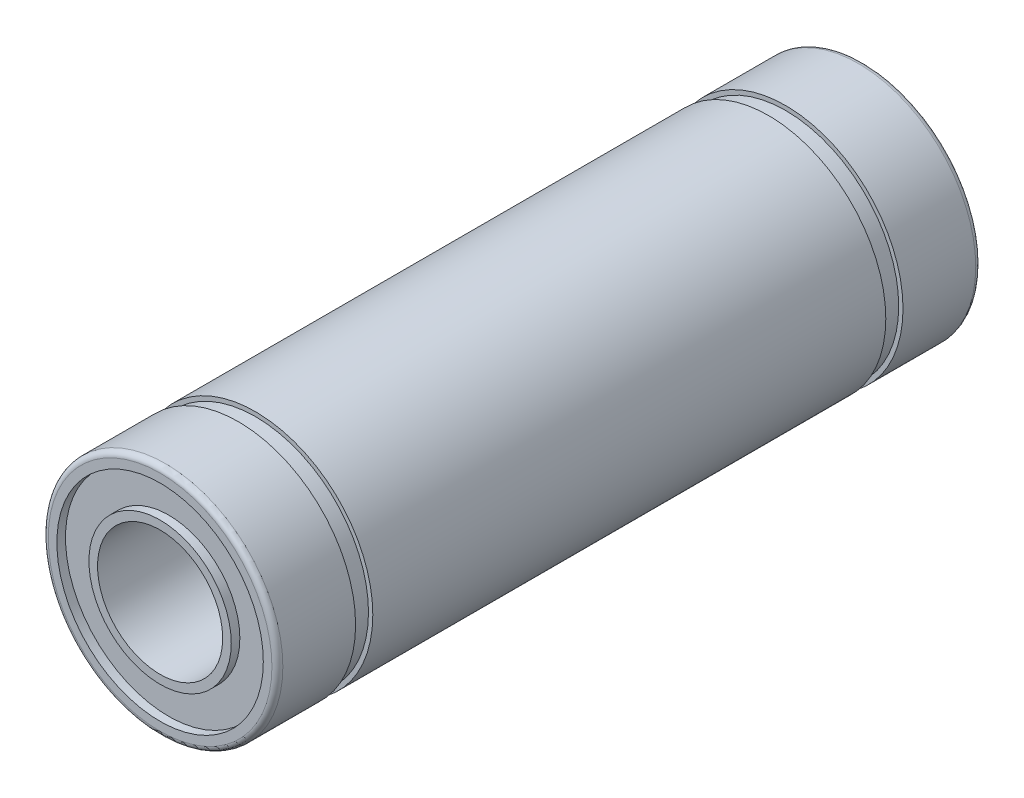
ISO-10303-21;
HEADER;
FILE_DESCRIPTION(('STEP AP214'),'2;1');
FILE_NAME('part.step','',(''),(''),'','','');
FILE_SCHEMA(('AUTOMOTIVE_DESIGN { 1 0 10303 214 1 1 1 1 }'));
ENDSEC;
DATA;
#1=APPLICATION_CONTEXT('core data for automotive mechanical design processes');
#2=APPLICATION_PROTOCOL_DEFINITION('international standard','automotive_design',2000,#1);
#3=PRODUCT_CONTEXT('',#1,'mechanical');
#4=PRODUCT('Part','Part','',(#3));
#5=PRODUCT_RELATED_PRODUCT_CATEGORY('part','',(#4));
#6=PRODUCT_DEFINITION_FORMATION('','',#4);
#7=PRODUCT_DEFINITION_CONTEXT('part definition',#1,'design');
#8=PRODUCT_DEFINITION('design','',#6,#7);
#9=PRODUCT_DEFINITION_SHAPE('','',#8);
#10=(LENGTH_UNIT() NAMED_UNIT(*) SI_UNIT(.MILLI.,.METRE.));
#11=(NAMED_UNIT(*) PLANE_ANGLE_UNIT() SI_UNIT($,.RADIAN.));
#12=(NAMED_UNIT(*) SI_UNIT($,.STERADIAN.) SOLID_ANGLE_UNIT());
#13=UNCERTAINTY_MEASURE_WITH_UNIT(LENGTH_MEASURE(1.E-05),#10,'distance_accuracy_value','');
#14=(GEOMETRIC_REPRESENTATION_CONTEXT(3) GLOBAL_UNCERTAINTY_ASSIGNED_CONTEXT((#13)) GLOBAL_UNIT_ASSIGNED_CONTEXT((#10,
#11,#12)) REPRESENTATION_CONTEXT('',''));
#15=CARTESIAN_POINT('',(0.,0.,0.));
#16=DIRECTION('',(0.,0.,1.));
#17=DIRECTION('',(1.,0.,0.));
#18=AXIS2_PLACEMENT_3D('',#15,#16,#17);
#19=CARTESIAN_POINT('',(0.,0.,45.));
#20=DIRECTION('',(0.,0.,1.));
#21=DIRECTION('',(0.,-1.,0.));
#22=AXIS2_PLACEMENT_3D('',#19,#20,#21);
#23=PLANE('',#22);
#24=CARTESIAN_POINT('',(0.,0.,45.));
#25=DIRECTION('',(0.,0.,1.));
#26=DIRECTION('',(1.,0.,0.));
#27=AXIS2_PLACEMENT_3D('',#24,#25,#26);
#28=CIRCLE('',#27,7.15);
#29=CARTESIAN_POINT('',(7.15,0.,45.));
#30=VERTEX_POINT('',#29);
#31=EDGE_CURVE('E11',#30,#30,#28,.T.);
#32=ORIENTED_EDGE('',*,*,#31,.F.);
#33=EDGE_LOOP('',(#32));
#34=FACE_BOUND('',#33,.T.);
#35=CARTESIAN_POINT('',(0.,0.,45.));
#36=DIRECTION('',(0.,0.,1.));
#37=DIRECTION('',(1.,0.,0.));
#38=AXIS2_PLACEMENT_3D('',#35,#36,#37);
#39=CIRCLE('',#38,7.151);
#40=CARTESIAN_POINT('',(7.151,0.,45.));
#41=VERTEX_POINT('',#40);
#42=EDGE_CURVE('E27',#41,#41,#39,.T.);
#43=ORIENTED_EDGE('',*,*,#42,.T.);
#44=EDGE_LOOP('',(#43));
#45=FACE_BOUND('',#44,.T.);
#46=ADVANCED_FACE('F17',(#34,#45),#23,.T.);
#47=CARTESIAN_POINT('',(0.,0.,45.));
#48=DIRECTION('',(0.,0.,1.));
#49=DIRECTION('',(0.,-1.,0.));
#50=AXIS2_PLACEMENT_3D('',#47,#48,#49);
#51=PLANE('',#50);
#52=CARTESIAN_POINT('',(0.,0.,45.));
#53=DIRECTION('',(0.,0.,1.));
#54=DIRECTION('',(1.,0.,0.));
#55=AXIS2_PLACEMENT_3D('',#52,#53,#54);
#56=CIRCLE('',#55,6.6);
#57=CARTESIAN_POINT('',(6.6,0.,45.));
#58=VERTEX_POINT('',#57);
#59=EDGE_CURVE('E151',#58,#58,#56,.T.);
#60=ORIENTED_EDGE('',*,*,#59,.F.);
#61=EDGE_LOOP('',(#60));
#62=FACE_BOUND('',#61,.T.);
#63=ORIENTED_EDGE('',*,*,#31,.T.);
#64=EDGE_LOOP('',(#63));
#65=FACE_BOUND('',#64,.T.);
#66=ADVANCED_FACE('F403',(#62,#65),#51,.T.);
#67=CARTESIAN_POINT('',(0.,0.,44.651));
#68=DIRECTION('',(0.,0.,-1.));
#69=DIRECTION('',(1.,0.,0.));
#70=AXIS2_PLACEMENT_3D('',#67,#68,#69);
#71=TOROIDAL_SURFACE('',#70,7.151,0.349);
#72=CARTESIAN_POINT('',(0.,0.,44.651));
#73=DIRECTION('',(0.,0.,1.));
#74=DIRECTION('',(1.,0.,0.));
#75=AXIS2_PLACEMENT_3D('',#72,#73,#74);
#76=CIRCLE('',#75,7.5);
#77=CARTESIAN_POINT('',(7.5,0.,44.651));
#78=VERTEX_POINT('',#77);
#79=EDGE_CURVE('E174',#78,#78,#76,.T.);
#80=ORIENTED_EDGE('',*,*,#79,.T.);
#81=CARTESIAN_POINT('',(7.151,0.,44.651));
#82=DIRECTION('',(0.,1.,0.));
#83=DIRECTION('',(1.,0.,0.));
#84=AXIS2_PLACEMENT_3D('',#81,#82,#83);
#85=CIRCLE('',#84,0.349);
#86=EDGE_CURVE('E21',#41,#78,#85,.T.);
#87=ORIENTED_EDGE('',*,*,#86,.F.);
#88=ORIENTED_EDGE('',*,*,#42,.F.);
#89=ORIENTED_EDGE('',*,*,#86,.T.);
#90=EDGE_LOOP('',(#80,#87,#88,#89));
#91=FACE_BOUND('',#90,.T.);
#92=ADVANCED_FACE('F290',(#91),#71,.T.);
#93=CARTESIAN_POINT('',(0.,0.,45.));
#94=DIRECTION('',(0.,0.,1.));
#95=DIRECTION('',(1.,0.,0.));
#96=AXIS2_PLACEMENT_3D('',#93,#94,#95);
#97=CYLINDRICAL_SURFACE('',#96,6.6);
#98=ORIENTED_EDGE('',*,*,#59,.T.);
#99=DIRECTION('',(0.,0.,-1.));
#100=VECTOR('',#99,1.);
#101=CARTESIAN_POINT('',(6.6,0.,45.));
#102=LINE('',#101,#100);
#103=CARTESIAN_POINT('',(6.6,0.,44.45));
#104=VERTEX_POINT('',#103);
#105=EDGE_CURVE('E92',#58,#104,#102,.T.);
#106=ORIENTED_EDGE('',*,*,#105,.T.);
#107=CARTESIAN_POINT('',(0.,0.,44.45));
#108=DIRECTION('',(0.,0.,1.));
#109=DIRECTION('',(1.,0.,0.));
#110=AXIS2_PLACEMENT_3D('',#107,#108,#109);
#111=CIRCLE('',#110,6.6);
#112=EDGE_CURVE('E161',#104,#104,#111,.T.);
#113=ORIENTED_EDGE('',*,*,#112,.F.);
#114=ORIENTED_EDGE('',*,*,#105,.F.);
#115=EDGE_LOOP('',(#98,#106,#113,#114));
#116=FACE_BOUND('',#115,.T.);
#117=ADVANCED_FACE('F386',(#116),#97,.F.);
#118=CARTESIAN_POINT('',(0.,0.,0.));
#119=DIRECTION('',(0.,0.,-1.));
#120=DIRECTION('',(1.,0.,0.));
#121=AXIS2_PLACEMENT_3D('',#118,#119,#120);
#122=CYLINDRICAL_SURFACE('',#121,7.5);
#123=DIRECTION('',(0.,0.,1.));
#124=VECTOR('',#123,1.);
#125=CARTESIAN_POINT('',(7.5,0.,0.));
#126=LINE('',#125,#124);
#127=CARTESIAN_POINT('',(7.5,0.,40.));
#128=VERTEX_POINT('',#127);
#129=EDGE_CURVE('E108',#128,#78,#126,.T.);
#130=ORIENTED_EDGE('',*,*,#129,.T.);
#131=ORIENTED_EDGE('',*,*,#79,.F.);
#132=ORIENTED_EDGE('',*,*,#129,.F.);
#133=CARTESIAN_POINT('',(0.,0.,40.));
#134=DIRECTION('',(0.,0.,1.));
#135=DIRECTION('',(1.,0.,0.));
#136=AXIS2_PLACEMENT_3D('',#133,#134,#135);
#137=CIRCLE('',#136,7.5);
#138=EDGE_CURVE('E158',#128,#128,#137,.T.);
#139=ORIENTED_EDGE('',*,*,#138,.T.);
#140=EDGE_LOOP('',(#130,#131,#132,#139));
#141=FACE_BOUND('',#140,.T.);
#142=ADVANCED_FACE('F287',(#141),#122,.T.);
#143=CARTESIAN_POINT('',(0.,0.,44.45));
#144=DIRECTION('',(0.,0.,1.));
#145=DIRECTION('',(0.,-1.,0.));
#146=AXIS2_PLACEMENT_3D('',#143,#144,#145);
#147=PLANE('',#146);
#148=CARTESIAN_POINT('',(0.,0.,44.45));
#149=DIRECTION('',(0.,0.,1.));
#150=DIRECTION('',(1.,0.,0.));
#151=AXIS2_PLACEMENT_3D('',#148,#149,#150);
#152=CIRCLE('',#151,4.55);
#153=CARTESIAN_POINT('',(4.55,0.,44.45));
#154=VERTEX_POINT('',#153);
#155=EDGE_CURVE('E162',#154,#154,#152,.T.);
#156=ORIENTED_EDGE('',*,*,#155,.F.);
#157=EDGE_LOOP('',(#156));
#158=FACE_BOUND('',#157,.T.);
#159=ORIENTED_EDGE('',*,*,#112,.T.);
#160=EDGE_LOOP('',(#159));
#161=FACE_BOUND('',#160,.T.);
#162=ADVANCED_FACE('F284',(#158,#161),#147,.T.);
#163=CARTESIAN_POINT('',(0.,0.,40.));
#164=DIRECTION('',(0.,0.,1.));
#165=DIRECTION('',(0.,-1.,0.));
#166=AXIS2_PLACEMENT_3D('',#163,#164,#165);
#167=PLANE('',#166);
#168=CARTESIAN_POINT('',(0.,0.,40.));
#169=DIRECTION('',(0.,0.,1.));
#170=DIRECTION('',(1.,0.,0.));
#171=AXIS2_PLACEMENT_3D('',#168,#169,#170);
#172=CIRCLE('',#171,7.225);
#173=CARTESIAN_POINT('',(7.225,0.,40.));
#174=VERTEX_POINT('',#173);
#175=EDGE_CURVE('E216',#174,#174,#172,.T.);
#176=ORIENTED_EDGE('',*,*,#175,.T.);
#177=EDGE_LOOP('',(#176));
#178=FACE_BOUND('',#177,.T.);
#179=ORIENTED_EDGE('',*,*,#138,.F.);
#180=EDGE_LOOP('',(#179));
#181=FACE_BOUND('',#180,.T.);
#182=ADVANCED_FACE('F280',(#178,#181),#167,.F.);
#183=CARTESIAN_POINT('',(0.,0.,45.));
#184=DIRECTION('',(0.,0.,1.));
#185=DIRECTION('',(1.,0.,0.));
#186=AXIS2_PLACEMENT_3D('',#183,#184,#185);
#187=CYLINDRICAL_SURFACE('',#186,4.55);
#188=DIRECTION('',(0.,0.,-1.));
#189=VECTOR('',#188,1.);
#190=CARTESIAN_POINT('',(4.55,0.,45.));
#191=LINE('',#190,#189);
#192=CARTESIAN_POINT('',(4.55,0.,45.));
#193=VERTEX_POINT('',#192);
#194=EDGE_CURVE('E189',#193,#154,#191,.T.);
#195=ORIENTED_EDGE('',*,*,#194,.T.);
#196=ORIENTED_EDGE('',*,*,#155,.T.);
#197=ORIENTED_EDGE('',*,*,#194,.F.);
#198=CARTESIAN_POINT('',(0.,0.,45.));
#199=DIRECTION('',(0.,0.,1.));
#200=DIRECTION('',(1.,0.,0.));
#201=AXIS2_PLACEMENT_3D('',#198,#199,#200);
#202=CIRCLE('',#201,4.55);
#203=EDGE_CURVE('E181',#193,#193,#202,.T.);
#204=ORIENTED_EDGE('',*,*,#203,.F.);
#205=EDGE_LOOP('',(#195,#196,#197,#204));
#206=FACE_BOUND('',#205,.T.);
#207=ADVANCED_FACE('F283',(#206),#187,.T.);
#208=CARTESIAN_POINT('',(0.,0.,40.));
#209=DIRECTION('',(0.,0.,1.));
#210=DIRECTION('',(1.,0.,0.));
#211=AXIS2_PLACEMENT_3D('',#208,#209,#210);
#212=CYLINDRICAL_SURFACE('',#211,7.225);
#213=DIRECTION('',(0.,0.,-1.));
#214=VECTOR('',#213,1.);
#215=CARTESIAN_POINT('',(7.225,0.,40.));
#216=LINE('',#215,#214);
#217=CARTESIAN_POINT('',(7.225,0.,38.9));
#218=VERTEX_POINT('',#217);
#219=EDGE_CURVE('E185',#174,#218,#216,.T.);
#220=ORIENTED_EDGE('',*,*,#219,.T.);
#221=CARTESIAN_POINT('',(0.,0.,38.9));
#222=DIRECTION('',(0.,0.,1.));
#223=DIRECTION('',(1.,0.,0.));
#224=AXIS2_PLACEMENT_3D('',#221,#222,#223);
#225=CIRCLE('',#224,7.225);
#226=EDGE_CURVE('E186',#218,#218,#225,.T.);
#227=ORIENTED_EDGE('',*,*,#226,.T.);
#228=ORIENTED_EDGE('',*,*,#219,.F.);
#229=ORIENTED_EDGE('',*,*,#175,.F.);
#230=EDGE_LOOP('',(#220,#227,#228,#229));
#231=FACE_BOUND('',#230,.T.);
#232=ADVANCED_FACE('F19',(#231),#212,.T.);
#233=CARTESIAN_POINT('',(0.,0.,45.));
#234=DIRECTION('',(0.,0.,1.));
#235=DIRECTION('',(0.,-1.,0.));
#236=AXIS2_PLACEMENT_3D('',#233,#234,#235);
#237=PLANE('',#236);
#238=CARTESIAN_POINT('',(0.,0.,45.));
#239=DIRECTION('',(0.,0.,1.));
#240=DIRECTION('',(1.,0.,0.));
#241=AXIS2_PLACEMENT_3D('',#238,#239,#240);
#242=CIRCLE('',#241,4.);
#243=CARTESIAN_POINT('',(4.,0.,45.));
#244=VERTEX_POINT('',#243);
#245=EDGE_CURVE('E167',#244,#244,#242,.T.);
#246=ORIENTED_EDGE('',*,*,#245,.F.);
#247=EDGE_LOOP('',(#246));
#248=FACE_BOUND('',#247,.T.);
#249=ORIENTED_EDGE('',*,*,#203,.T.);
#250=EDGE_LOOP('',(#249));
#251=FACE_BOUND('',#250,.T.);
#252=ADVANCED_FACE('F301',(#248,#251),#237,.T.);
#253=CARTESIAN_POINT('',(0.,0.,38.9));
#254=DIRECTION('',(0.,0.,1.));
#255=DIRECTION('',(0.,-1.,0.));
#256=AXIS2_PLACEMENT_3D('',#253,#254,#255);
#257=PLANE('',#256);
#258=ORIENTED_EDGE('',*,*,#226,.F.);
#259=EDGE_LOOP('',(#258));
#260=FACE_BOUND('',#259,.T.);
#261=CARTESIAN_POINT('',(0.,0.,38.9));
#262=DIRECTION('',(0.,0.,1.));
#263=DIRECTION('',(1.,0.,0.));
#264=AXIS2_PLACEMENT_3D('',#261,#262,#263);
#265=CIRCLE('',#264,7.5);
#266=CARTESIAN_POINT('',(7.5,0.,38.9));
#267=VERTEX_POINT('',#266);
#268=EDGE_CURVE('E235',#267,#267,#265,.T.);
#269=ORIENTED_EDGE('',*,*,#268,.T.);
#270=EDGE_LOOP('',(#269));
#271=FACE_BOUND('',#270,.T.);
#272=ADVANCED_FACE('F295',(#260,#271),#257,.T.);
#273=CARTESIAN_POINT('',(0.,0.,0.));
#274=DIRECTION('',(0.,0.,-1.));
#275=DIRECTION('',(1.,0.,0.));
#276=AXIS2_PLACEMENT_3D('',#273,#274,#275);
#277=CYLINDRICAL_SURFACE('',#276,4.);
#278=DIRECTION('',(0.,0.,1.));
#279=VECTOR('',#278,1.);
#280=CARTESIAN_POINT('',(4.,0.,0.));
#281=LINE('',#280,#279);
#282=CARTESIAN_POINT('',(4.,0.,0.));
#283=VERTEX_POINT('',#282);
#284=EDGE_CURVE('E163',#283,#244,#281,.T.);
#285=ORIENTED_EDGE('',*,*,#284,.T.);
#286=ORIENTED_EDGE('',*,*,#245,.T.);
#287=ORIENTED_EDGE('',*,*,#284,.F.);
#288=CARTESIAN_POINT('',(0.,0.,0.));
#289=DIRECTION('',(0.,0.,1.));
#290=DIRECTION('',(1.,0.,0.));
#291=AXIS2_PLACEMENT_3D('',#288,#289,#290);
#292=CIRCLE('',#291,4.);
#293=EDGE_CURVE('E212',#283,#283,#292,.T.);
#294=ORIENTED_EDGE('',*,*,#293,.F.);
#295=EDGE_LOOP('',(#285,#286,#287,#294));
#296=FACE_BOUND('',#295,.T.);
#297=ADVANCED_FACE('F300',(#296),#277,.F.);
#298=CARTESIAN_POINT('',(0.,0.,0.));
#299=DIRECTION('',(0.,0.,-1.));
#300=DIRECTION('',(1.,0.,0.));
#301=AXIS2_PLACEMENT_3D('',#298,#299,#300);
#302=CYLINDRICAL_SURFACE('',#301,7.5);
#303=ORIENTED_EDGE('',*,*,#268,.F.);
#304=DIRECTION('',(0.,0.,1.));
#305=VECTOR('',#304,1.);
#306=CARTESIAN_POINT('',(7.5,0.,0.));
#307=LINE('',#306,#305);
#308=CARTESIAN_POINT('',(7.5,0.,6.1));
#309=VERTEX_POINT('',#308);
#310=EDGE_CURVE('E168',#309,#267,#307,.T.);
#311=ORIENTED_EDGE('',*,*,#310,.F.);
#312=CARTESIAN_POINT('',(0.,0.,6.1));
#313=DIRECTION('',(0.,0.,-1.));
#314=DIRECTION('',(1.,0.,0.));
#315=AXIS2_PLACEMENT_3D('',#312,#313,#314);
#316=CIRCLE('',#315,7.5);
#317=EDGE_CURVE('E208',#309,#309,#316,.T.);
#318=ORIENTED_EDGE('',*,*,#317,.F.);
#319=ORIENTED_EDGE('',*,*,#310,.T.);
#320=EDGE_LOOP('',(#303,#311,#318,#319));
#321=FACE_BOUND('',#320,.T.);
#322=ADVANCED_FACE('F323',(#321),#302,.T.);
#323=CARTESIAN_POINT('',(0.,0.,0.));
#324=DIRECTION('',(0.,0.,1.));
#325=DIRECTION('',(0.,-1.,0.));
#326=AXIS2_PLACEMENT_3D('',#323,#324,#325);
#327=PLANE('',#326);
#328=ORIENTED_EDGE('',*,*,#293,.T.);
#329=EDGE_LOOP('',(#328));
#330=FACE_BOUND('',#329,.T.);
#331=CARTESIAN_POINT('',(0.,0.,0.));
#332=DIRECTION('',(0.,0.,1.));
#333=DIRECTION('',(1.,0.,0.));
#334=AXIS2_PLACEMENT_3D('',#331,#332,#333);
#335=CIRCLE('',#334,4.55);
#336=CARTESIAN_POINT('',(4.55,0.,0.));
#337=VERTEX_POINT('',#336);
#338=EDGE_CURVE('E134',#337,#337,#335,.T.);
#339=ORIENTED_EDGE('',*,*,#338,.F.);
#340=EDGE_LOOP('',(#339));
#341=FACE_BOUND('',#340,.T.);
#342=ADVANCED_FACE('F316',(#330,#341),#327,.F.);
#343=CARTESIAN_POINT('',(0.,0.,6.1));
#344=DIRECTION('',(0.,0.,-1.));
#345=DIRECTION('',(0.,-1.,0.));
#346=AXIS2_PLACEMENT_3D('',#343,#344,#345);
#347=PLANE('',#346);
#348=CARTESIAN_POINT('',(0.,0.,6.1));
#349=DIRECTION('',(0.,0.,-1.));
#350=DIRECTION('',(1.,0.,0.));
#351=AXIS2_PLACEMENT_3D('',#348,#349,#350);
#352=CIRCLE('',#351,7.225);
#353=CARTESIAN_POINT('',(7.225,0.,6.1));
#354=VERTEX_POINT('',#353);
#355=EDGE_CURVE('E127',#354,#354,#352,.T.);
#356=ORIENTED_EDGE('',*,*,#355,.F.);
#357=EDGE_LOOP('',(#356));
#358=FACE_BOUND('',#357,.T.);
#359=ORIENTED_EDGE('',*,*,#317,.T.);
#360=EDGE_LOOP('',(#359));
#361=FACE_BOUND('',#360,.T.);
#362=ADVANCED_FACE('F310',(#358,#361),#347,.T.);
#363=CARTESIAN_POINT('',(0.,0.,0.));
#364=DIRECTION('',(0.,0.,-1.));
#365=DIRECTION('',(1.,0.,0.));
#366=AXIS2_PLACEMENT_3D('',#363,#364,#365);
#367=CYLINDRICAL_SURFACE('',#366,4.55);
#368=ORIENTED_EDGE('',*,*,#338,.T.);
#369=DIRECTION('',(0.,0.,1.));
#370=VECTOR('',#369,1.);
#371=CARTESIAN_POINT('',(4.55,0.,0.));
#372=LINE('',#371,#370);
#373=CARTESIAN_POINT('',(4.55,0.,0.55));
#374=VERTEX_POINT('',#373);
#375=EDGE_CURVE('E140',#337,#374,#372,.T.);
#376=ORIENTED_EDGE('',*,*,#375,.T.);
#377=CARTESIAN_POINT('',(0.,0.,0.55));
#378=DIRECTION('',(0.,0.,1.));
#379=DIRECTION('',(1.,0.,0.));
#380=AXIS2_PLACEMENT_3D('',#377,#378,#379);
#381=CIRCLE('',#380,4.55);
#382=EDGE_CURVE('E143',#374,#374,#381,.T.);
#383=ORIENTED_EDGE('',*,*,#382,.F.);
#384=ORIENTED_EDGE('',*,*,#375,.F.);
#385=EDGE_LOOP('',(#368,#376,#383,#384));
#386=FACE_BOUND('',#385,.T.);
#387=ADVANCED_FACE('F315',(#386),#367,.T.);
#388=CARTESIAN_POINT('',(0.,0.,5.));
#389=DIRECTION('',(0.,0.,-1.));
#390=DIRECTION('',(1.,0.,0.));
#391=AXIS2_PLACEMENT_3D('',#388,#389,#390);
#392=CYLINDRICAL_SURFACE('',#391,7.225);
#393=DIRECTION('',(0.,0.,1.));
#394=VECTOR('',#393,1.);
#395=CARTESIAN_POINT('',(7.225,0.,5.));
#396=LINE('',#395,#394);
#397=CARTESIAN_POINT('',(7.225,0.,5.));
#398=VERTEX_POINT('',#397);
#399=EDGE_CURVE('E130',#398,#354,#396,.T.);
#400=ORIENTED_EDGE('',*,*,#399,.T.);
#401=ORIENTED_EDGE('',*,*,#355,.T.);
#402=ORIENTED_EDGE('',*,*,#399,.F.);
#403=CARTESIAN_POINT('',(0.,0.,5.));
#404=DIRECTION('',(0.,0.,-1.));
#405=DIRECTION('',(1.,0.,0.));
#406=AXIS2_PLACEMENT_3D('',#403,#404,#405);
#407=CIRCLE('',#406,7.225);
#408=EDGE_CURVE('E148',#398,#398,#407,.T.);
#409=ORIENTED_EDGE('',*,*,#408,.F.);
#410=EDGE_LOOP('',(#400,#401,#402,#409));
#411=FACE_BOUND('',#410,.T.);
#412=ADVANCED_FACE('F128',(#411),#392,.T.);
#413=CARTESIAN_POINT('',(0.,0.,0.55));
#414=DIRECTION('',(0.,0.,1.));
#415=DIRECTION('',(1.,0.,0.));
#416=AXIS2_PLACEMENT_3D('',#413,#414,#415);
#417=PLANE('',#416);
#418=ORIENTED_EDGE('',*,*,#382,.T.);
#419=EDGE_LOOP('',(#418));
#420=FACE_BOUND('',#419,.T.);
#421=CARTESIAN_POINT('',(0.,0.,0.55));
#422=DIRECTION('',(0.,0.,1.));
#423=DIRECTION('',(1.,0.,0.));
#424=AXIS2_PLACEMENT_3D('',#421,#422,#423);
#425=CIRCLE('',#424,6.6);
#426=CARTESIAN_POINT('',(6.6,0.,0.55));
#427=VERTEX_POINT('',#426);
#428=EDGE_CURVE('E204',#427,#427,#425,.T.);
#429=ORIENTED_EDGE('',*,*,#428,.F.);
#430=EDGE_LOOP('',(#429));
#431=FACE_BOUND('',#430,.T.);
#432=ADVANCED_FACE('F413',(#420,#431),#417,.F.);
#433=CARTESIAN_POINT('',(0.,0.,5.));
#434=DIRECTION('',(0.,0.,-1.));
#435=DIRECTION('',(0.,-1.,0.));
#436=AXIS2_PLACEMENT_3D('',#433,#434,#435);
#437=PLANE('',#436);
#438=ORIENTED_EDGE('',*,*,#408,.T.);
#439=EDGE_LOOP('',(#438));
#440=FACE_BOUND('',#439,.T.);
#441=CARTESIAN_POINT('',(0.,0.,5.));
#442=DIRECTION('',(0.,0.,-1.));
#443=DIRECTION('',(1.,0.,0.));
#444=AXIS2_PLACEMENT_3D('',#441,#442,#443);
#445=CIRCLE('',#444,7.5);
#446=CARTESIAN_POINT('',(7.5,0.,5.));
#447=VERTEX_POINT('',#446);
#448=EDGE_CURVE('E225',#447,#447,#445,.T.);
#449=ORIENTED_EDGE('',*,*,#448,.F.);
#450=EDGE_LOOP('',(#449));
#451=FACE_BOUND('',#450,.T.);
#452=ADVANCED_FACE('F375',(#440,#451),#437,.F.);
#453=CARTESIAN_POINT('',(0.,0.,0.));
#454=DIRECTION('',(0.,0.,-1.));
#455=DIRECTION('',(1.,0.,0.));
#456=AXIS2_PLACEMENT_3D('',#453,#454,#455);
#457=CYLINDRICAL_SURFACE('',#456,6.6);
#458=DIRECTION('',(0.,0.,1.));
#459=VECTOR('',#458,1.);
#460=CARTESIAN_POINT('',(6.6,0.,0.));
#461=LINE('',#460,#459);
#462=CARTESIAN_POINT('',(6.6,0.,0.));
#463=VERTEX_POINT('',#462);
#464=EDGE_CURVE('E207',#463,#427,#461,.T.);
#465=ORIENTED_EDGE('',*,*,#464,.T.);
#466=ORIENTED_EDGE('',*,*,#428,.T.);
#467=ORIENTED_EDGE('',*,*,#464,.F.);
#468=CARTESIAN_POINT('',(0.,0.,0.));
#469=DIRECTION('',(0.,0.,1.));
#470=DIRECTION('',(1.,0.,0.));
#471=AXIS2_PLACEMENT_3D('',#468,#469,#470);
#472=CIRCLE('',#471,6.6);
#473=EDGE_CURVE('E156',#463,#463,#472,.T.);
#474=ORIENTED_EDGE('',*,*,#473,.F.);
#475=EDGE_LOOP('',(#465,#466,#467,#474));
#476=FACE_BOUND('',#475,.T.);
#477=ADVANCED_FACE('F370',(#476),#457,.F.);
#478=CARTESIAN_POINT('',(0.,0.,0.));
#479=DIRECTION('',(0.,0.,-1.));
#480=DIRECTION('',(1.,0.,0.));
#481=AXIS2_PLACEMENT_3D('',#478,#479,#480);
#482=CYLINDRICAL_SURFACE('',#481,7.5);
#483=DIRECTION('',(0.,0.,1.));
#484=VECTOR('',#483,1.);
#485=CARTESIAN_POINT('',(7.5,0.,0.));
#486=LINE('',#485,#484);
#487=CARTESIAN_POINT('',(7.5,0.,0.349));
#488=VERTEX_POINT('',#487);
#489=EDGE_CURVE('E199',#488,#447,#486,.T.);
#490=ORIENTED_EDGE('',*,*,#489,.T.);
#491=ORIENTED_EDGE('',*,*,#448,.T.);
#492=ORIENTED_EDGE('',*,*,#489,.F.);
#493=CARTESIAN_POINT('',(0.,0.,0.349));
#494=DIRECTION('',(0.,0.,1.));
#495=DIRECTION('',(1.,0.,0.));
#496=AXIS2_PLACEMENT_3D('',#493,#494,#495);
#497=CIRCLE('',#496,7.5);
#498=EDGE_CURVE('E152',#488,#488,#497,.T.);
#499=ORIENTED_EDGE('',*,*,#498,.T.);
#500=EDGE_LOOP('',(#490,#491,#492,#499));
#501=FACE_BOUND('',#500,.T.);
#502=ADVANCED_FACE('F254',(#501),#482,.T.);
#503=CARTESIAN_POINT('',(0.,0.,0.));
#504=DIRECTION('',(0.,0.,1.));
#505=DIRECTION('',(0.,-1.,0.));
#506=AXIS2_PLACEMENT_3D('',#503,#504,#505);
#507=PLANE('',#506);
#508=ORIENTED_EDGE('',*,*,#473,.T.);
#509=EDGE_LOOP('',(#508));
#510=FACE_BOUND('',#509,.T.);
#511=CARTESIAN_POINT('',(0.,0.,0.));
#512=DIRECTION('',(0.,0.,1.));
#513=DIRECTION('',(1.,0.,0.));
#514=AXIS2_PLACEMENT_3D('',#511,#512,#513);
#515=CIRCLE('',#514,7.15);
#516=CARTESIAN_POINT('',(7.15,0.,0.));
#517=VERTEX_POINT('',#516);
#518=EDGE_CURVE('E173',#517,#517,#515,.T.);
#519=ORIENTED_EDGE('',*,*,#518,.F.);
#520=EDGE_LOOP('',(#519));
#521=FACE_BOUND('',#520,.T.);
#522=ADVANCED_FACE('F333',(#510,#521),#507,.F.);
#523=CARTESIAN_POINT('',(0.,0.,0.349));
#524=DIRECTION('',(0.,0.,1.));
#525=DIRECTION('',(1.,0.,0.));
#526=AXIS2_PLACEMENT_3D('',#523,#524,#525);
#527=TOROIDAL_SURFACE('',#526,7.151,0.349);
#528=CARTESIAN_POINT('',(7.151,0.,0.349));
#529=DIRECTION('',(0.,-1.,0.));
#530=DIRECTION('',(1.,0.,0.));
#531=AXIS2_PLACEMENT_3D('',#528,#529,#530);
#532=CIRCLE('',#531,0.349);
#533=CARTESIAN_POINT('',(7.151,0.,0.));
#534=VERTEX_POINT('',#533);
#535=EDGE_CURVE('E157',#534,#488,#532,.T.);
#536=ORIENTED_EDGE('',*,*,#535,.F.);
#537=CARTESIAN_POINT('',(0.,0.,0.));
#538=DIRECTION('',(0.,0.,1.));
#539=DIRECTION('',(1.,0.,0.));
#540=AXIS2_PLACEMENT_3D('',#537,#538,#539);
#541=CIRCLE('',#540,7.151);
#542=EDGE_CURVE('E169',#534,#534,#541,.T.);
#543=ORIENTED_EDGE('',*,*,#542,.T.);
#544=ORIENTED_EDGE('',*,*,#535,.T.);
#545=ORIENTED_EDGE('',*,*,#498,.F.);
#546=EDGE_LOOP('',(#536,#543,#544,#545));
#547=FACE_BOUND('',#546,.T.);
#548=ADVANCED_FACE('F338',(#547),#527,.T.);
#549=CARTESIAN_POINT('',(0.,0.,0.));
#550=DIRECTION('',(0.,0.,1.));
#551=DIRECTION('',(0.,-1.,0.));
#552=AXIS2_PLACEMENT_3D('',#549,#550,#551);
#553=PLANE('',#552);
#554=ORIENTED_EDGE('',*,*,#518,.T.);
#555=EDGE_LOOP('',(#554));
#556=FACE_BOUND('',#555,.T.);
#557=ORIENTED_EDGE('',*,*,#542,.F.);
#558=EDGE_LOOP('',(#557));
#559=FACE_BOUND('',#558,.T.);
#560=ADVANCED_FACE('F471',(#556,#559),#553,.F.);
#561=CLOSED_SHELL('',(#46,#66,#92,#117,#142,#162,#182,#207,#232,#252,#272,#297,#322,#342,#362,
#387,#412,#432,#452,#477,#502,#522,#548,#560));
#562=MANIFOLD_SOLID_BREP('B1',#561);
#563=ADVANCED_BREP_SHAPE_REPRESENTATION('',(#18,#562),#14);
#564=SHAPE_DEFINITION_REPRESENTATION(#9,#563);
ENDSEC;
END-ISO-10303-21;
